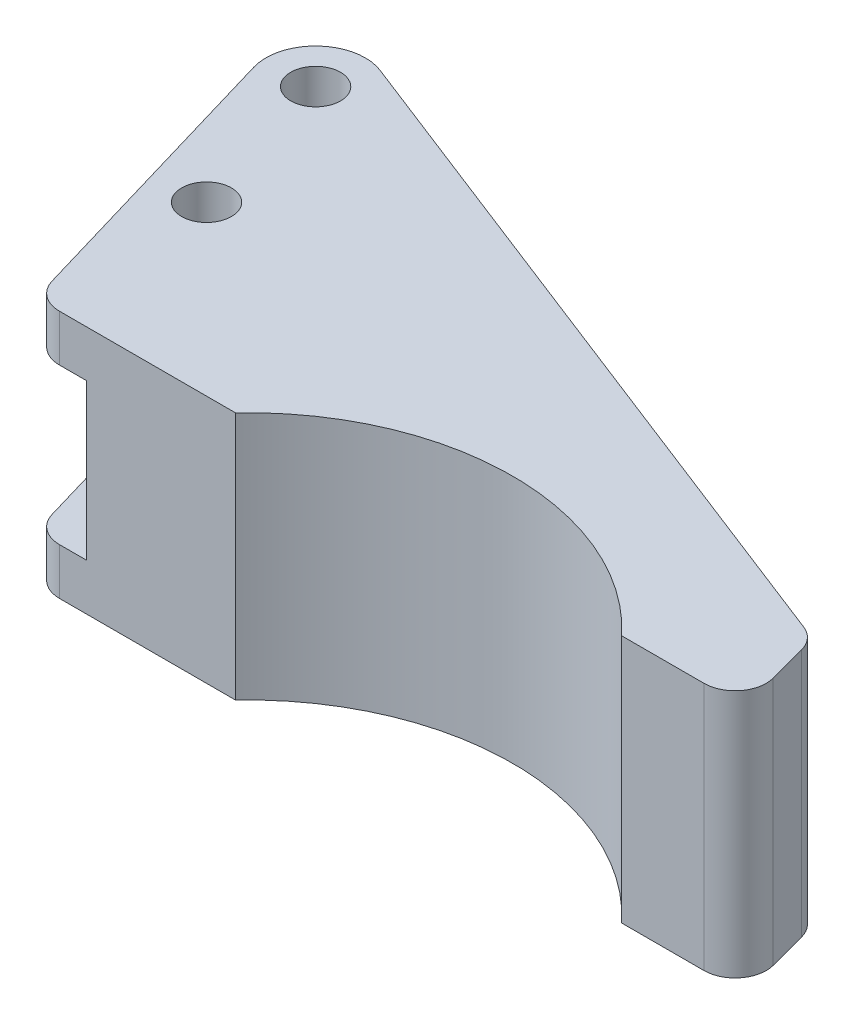
ISO-10303-21;
HEADER;
FILE_DESCRIPTION(('STEP AP214'),'2;1');
FILE_NAME('part.step','',(''),(''),'','','');
FILE_SCHEMA(('AUTOMOTIVE_DESIGN { 1 0 10303 214 1 1 1 1 }'));
ENDSEC;
DATA;
#1=APPLICATION_CONTEXT('core data for automotive mechanical design processes');
#2=APPLICATION_PROTOCOL_DEFINITION('international standard','automotive_design',2000,#1);
#3=PRODUCT_CONTEXT('',#1,'mechanical');
#4=PRODUCT('Part','Part','',(#3));
#5=PRODUCT_RELATED_PRODUCT_CATEGORY('part','',(#4));
#6=PRODUCT_DEFINITION_FORMATION('','',#4);
#7=PRODUCT_DEFINITION_CONTEXT('part definition',#1,'design');
#8=PRODUCT_DEFINITION('design','',#6,#7);
#9=PRODUCT_DEFINITION_SHAPE('','',#8);
#10=(LENGTH_UNIT() NAMED_UNIT(*) SI_UNIT(.MILLI.,.METRE.));
#11=(NAMED_UNIT(*) PLANE_ANGLE_UNIT() SI_UNIT($,.RADIAN.));
#12=(NAMED_UNIT(*) SI_UNIT($,.STERADIAN.) SOLID_ANGLE_UNIT());
#13=UNCERTAINTY_MEASURE_WITH_UNIT(LENGTH_MEASURE(1.E-05),#10,'distance_accuracy_value','');
#14=(GEOMETRIC_REPRESENTATION_CONTEXT(3) GLOBAL_UNCERTAINTY_ASSIGNED_CONTEXT((#13)) GLOBAL_UNIT_ASSIGNED_CONTEXT((#10,
#11,#12)) REPRESENTATION_CONTEXT('',''));
#15=CARTESIAN_POINT('',(0.,0.,0.));
#16=DIRECTION('',(0.,0.,1.));
#17=DIRECTION('',(1.,0.,0.));
#18=AXIS2_PLACEMENT_3D('',#15,#16,#17);
#19=CARTESIAN_POINT('',(-61.4781120918837,40.,-51.87));
#20=DIRECTION('',(0.,-1.,0.));
#21=DIRECTION('',(0.,0.,-1.));
#22=AXIS2_PLACEMENT_3D('',#19,#20,#21);
#23=CYLINDRICAL_SURFACE('',#22,8.);
#24=DIRECTION('',(0.,-1.,0.));
#25=VECTOR('',#24,1.);
#26=CARTESIAN_POINT('',(-69.1516005038733,40.,-49.607794087387));
#27=LINE('',#26,#25);
#28=CARTESIAN_POINT('',(-69.1516005038733,7.5,-49.607794087387));
#29=VERTEX_POINT('',#28);
#30=CARTESIAN_POINT('',(-69.1516005038733,0.,-49.607794087387));
#31=VERTEX_POINT('',#30);
#32=EDGE_CURVE('E148',#29,#31,#27,.T.);
#33=ORIENTED_EDGE('',*,*,#32,.F.);
#34=CARTESIAN_POINT('',(-61.4781120918837,7.5,-51.87));
#35=DIRECTION('',(0.,-1.,0.));
#36=DIRECTION('',(0.,0.,-1.));
#37=AXIS2_PLACEMENT_3D('',#34,#35,#36);
#38=CIRCLE('',#37,8.);
#39=CARTESIAN_POINT('',(-58.5744406098046,7.5,-59.324441087309));
#40=VERTEX_POINT('',#39);
#41=EDGE_CURVE('E231',#29,#40,#38,.T.);
#42=ORIENTED_EDGE('',*,*,#41,.T.);
#43=DIRECTION('',(0.,-1.,0.));
#44=VECTOR('',#43,1.);
#45=CARTESIAN_POINT('',(-58.5744406098046,40.,-59.324441087309));
#46=LINE('',#45,#44);
#47=CARTESIAN_POINT('',(-58.5744406098046,0.,-59.324441087309));
#48=VERTEX_POINT('',#47);
#49=EDGE_CURVE('E190',#40,#48,#46,.T.);
#50=ORIENTED_EDGE('',*,*,#49,.T.);
#51=CARTESIAN_POINT('',(-61.4781120918837,0.,-51.87));
#52=DIRECTION('',(0.,1.,0.));
#53=DIRECTION('',(0.,0.,1.));
#54=AXIS2_PLACEMENT_3D('',#51,#52,#53);
#55=CIRCLE('',#54,8.);
#56=EDGE_CURVE('E174',#48,#31,#55,.T.);
#57=ORIENTED_EDGE('',*,*,#56,.T.);
#58=EDGE_LOOP('',(#33,#42,#50,#57));
#59=FACE_BOUND('',#58,.T.);
#60=ADVANCED_FACE('F33',(#59),#23,.T.);
#61=CARTESIAN_POINT('',(-69.1516005038733,40.,-49.607794087387));
#62=DIRECTION('',(0.959186051498703,0.,-0.282775739076619));
#63=DIRECTION('',(-0.282775739076619,0.,-0.959186051498703));
#64=AXIS2_PLACEMENT_3D('',#61,#62,#63);
#65=PLANE('',#64);
#66=CARTESIAN_POINT('',(-69.1516005038733,40.,-49.607794087387));
#67=VERTEX_POINT('',#66);
#68=CARTESIAN_POINT('',(-69.1516005038733,32.5,-49.607794087387));
#69=VERTEX_POINT('',#68);
#70=EDGE_CURVE('E188',#67,#69,#27,.T.);
#71=ORIENTED_EDGE('',*,*,#70,.T.);
#72=DIRECTION('',(0.282775739076619,0.,0.959186051498703));
#73=VECTOR('',#72,1.);
#74=CARTESIAN_POINT('',(-69.1516005038733,32.5,-49.607794087387));
#75=LINE('',#74,#73);
#76=CARTESIAN_POINT('',(-55.5840423493772,32.5,-3.5861213046169));
#77=VERTEX_POINT('',#76);
#78=EDGE_CURVE('E145',#69,#77,#75,.T.);
#79=ORIENTED_EDGE('',*,*,#78,.T.);
#80=DIRECTION('',(0.,-1.,0.));
#81=VECTOR('',#80,1.);
#82=CARTESIAN_POINT('',(-55.5840423493772,40.,-3.5861213046169));
#83=LINE('',#82,#81);
#84=CARTESIAN_POINT('',(-55.5840423493772,40.,-3.5861213046169));
#85=VERTEX_POINT('',#84);
#86=EDGE_CURVE('E141',#85,#77,#83,.T.);
#87=ORIENTED_EDGE('',*,*,#86,.F.);
#88=DIRECTION('',(0.282775739076619,0.,0.959186051498703));
#89=VECTOR('',#88,1.);
#90=CARTESIAN_POINT('',(-69.1516005038733,40.,-49.607794087387));
#91=LINE('',#90,#89);
#92=EDGE_CURVE('E126',#67,#85,#91,.T.);
#93=ORIENTED_EDGE('',*,*,#92,.F.);
#94=EDGE_LOOP('',(#71,#79,#87,#93));
#95=FACE_BOUND('',#94,.T.);
#96=ADVANCED_FACE('F142',(#95),#65,.F.);
#97=CARTESIAN_POINT('',(-50.7881120918837,40.,-5.));
#98=DIRECTION('',(0.,-1.,0.));
#99=DIRECTION('',(0.,0.,-1.));
#100=AXIS2_PLACEMENT_3D('',#97,#98,#99);
#101=CYLINDRICAL_SURFACE('',#100,5.00000000000001);
#102=ORIENTED_EDGE('',*,*,#86,.T.);
#103=CARTESIAN_POINT('',(-50.7881120918837,32.5,-5.));
#104=DIRECTION('',(0.,1.,0.));
#105=DIRECTION('',(0.,0.,1.));
#106=AXIS2_PLACEMENT_3D('',#103,#104,#105);
#107=CIRCLE('',#106,5.00000000000001);
#108=CARTESIAN_POINT('',(-50.7881120918837,32.5,0.));
#109=VERTEX_POINT('',#108);
#110=EDGE_CURVE('E240',#77,#109,#107,.T.);
#111=ORIENTED_EDGE('',*,*,#110,.T.);
#112=DIRECTION('',(0.,-1.,0.));
#113=VECTOR('',#112,1.);
#114=CARTESIAN_POINT('',(-50.7881120918837,40.,0.));
#115=LINE('',#114,#113);
#116=CARTESIAN_POINT('',(-50.7881120918837,40.,0.));
#117=VERTEX_POINT('',#116);
#118=EDGE_CURVE('E153',#117,#109,#115,.T.);
#119=ORIENTED_EDGE('',*,*,#118,.F.);
#120=CARTESIAN_POINT('',(-50.7881120918837,40.,-5.));
#121=DIRECTION('',(0.,1.,0.));
#122=DIRECTION('',(0.,0.,1.));
#123=AXIS2_PLACEMENT_3D('',#120,#121,#122);
#124=CIRCLE('',#123,5.00000000000001);
#125=EDGE_CURVE('E131',#85,#117,#124,.T.);
#126=ORIENTED_EDGE('',*,*,#125,.F.);
#127=EDGE_LOOP('',(#102,#111,#119,#126));
#128=FACE_BOUND('',#127,.T.);
#129=ADVANCED_FACE('F151',(#128),#101,.T.);
#130=CARTESIAN_POINT('',(-54.1481120918837,40.,-27.));
#131=DIRECTION('',(0.,-1.,0.));
#132=DIRECTION('',(0.,0.,-1.));
#133=AXIS2_PLACEMENT_3D('',#130,#131,#132);
#134=CYLINDRICAL_SURFACE('',#133,4.00000000000001);
#135=CARTESIAN_POINT('',(-54.1481120918837,32.5,-27.));
#136=DIRECTION('',(0.,1.,0.));
#137=DIRECTION('',(0.,0.,1.));
#138=AXIS2_PLACEMENT_3D('',#135,#136,#137);
#139=CIRCLE('',#138,4.00000000000001);
#140=CARTESIAN_POINT('',(-54.1481120918837,32.5,-23.));
#141=VERTEX_POINT('',#140);
#142=EDGE_CURVE('E237',#141,#141,#139,.T.);
#143=ORIENTED_EDGE('',*,*,#142,.F.);
#144=EDGE_LOOP('',(#143));
#145=FACE_BOUND('',#144,.T.);
#146=CARTESIAN_POINT('',(-54.1481120918837,40.,-27.));
#147=DIRECTION('',(0.,1.,0.));
#148=DIRECTION('',(0.,0.,1.));
#149=AXIS2_PLACEMENT_3D('',#146,#147,#148);
#150=CIRCLE('',#149,4.00000000000001);
#151=CARTESIAN_POINT('',(-54.1481120918837,40.,-23.));
#152=VERTEX_POINT('',#151);
#153=EDGE_CURVE('E163',#152,#152,#150,.T.);
#154=ORIENTED_EDGE('',*,*,#153,.T.);
#155=EDGE_LOOP('',(#154));
#156=FACE_BOUND('',#155,.T.);
#157=ADVANCED_FACE('F357',(#145,#156),#134,.F.);
#158=CARTESIAN_POINT('',(-61.4781120918837,40.,-51.87));
#159=DIRECTION('',(0.,-1.,0.));
#160=DIRECTION('',(0.,0.,-1.));
#161=AXIS2_PLACEMENT_3D('',#158,#159,#160);
#162=CYLINDRICAL_SURFACE('',#161,4.00000000000001);
#163=CARTESIAN_POINT('',(-61.4781120918837,32.5,-51.87));
#164=DIRECTION('',(0.,1.,0.));
#165=DIRECTION('',(0.,0.,1.));
#166=AXIS2_PLACEMENT_3D('',#163,#164,#165);
#167=CIRCLE('',#166,4.00000000000001);
#168=CARTESIAN_POINT('',(-61.4781120918837,32.5,-47.87));
#169=VERTEX_POINT('',#168);
#170=EDGE_CURVE('E37',#169,#169,#167,.T.);
#171=ORIENTED_EDGE('',*,*,#170,.F.);
#172=EDGE_LOOP('',(#171));
#173=FACE_BOUND('',#172,.T.);
#174=CARTESIAN_POINT('',(-61.4781120918837,40.,-51.87));
#175=DIRECTION('',(0.,1.,0.));
#176=DIRECTION('',(0.,0.,1.));
#177=AXIS2_PLACEMENT_3D('',#174,#175,#176);
#178=CIRCLE('',#177,4.00000000000001);
#179=CARTESIAN_POINT('',(-61.4781120918837,40.,-47.87));
#180=VERTEX_POINT('',#179);
#181=EDGE_CURVE('E253',#180,#180,#178,.T.);
#182=ORIENTED_EDGE('',*,*,#181,.T.);
#183=EDGE_LOOP('',(#182));
#184=FACE_BOUND('',#183,.T.);
#185=ADVANCED_FACE('F388',(#173,#184),#162,.F.);
#186=CARTESIAN_POINT('',(8.5618879081163,40.,29.01));
#187=DIRECTION('',(0.,-1.,0.));
#188=DIRECTION('',(0.,0.,-1.));
#189=AXIS2_PLACEMENT_3D('',#186,#187,#188);
#190=PLANE('',#189);
#191=CARTESIAN_POINT('',(8.5618879081163,40.,29.01));
#192=DIRECTION('',(0.,-1.,0.));
#193=DIRECTION('',(0.,0.,-1.));
#194=AXIS2_PLACEMENT_3D('',#191,#192,#193);
#195=CIRCLE('',#194,42.49);
#196=CARTESIAN_POINT('',(-22.4835626442593,40.,0.));
#197=VERTEX_POINT('',#196);
#198=CARTESIAN_POINT('',(39.6073384604919,40.,0.));
#199=VERTEX_POINT('',#198);
#200=EDGE_CURVE('E184',#197,#199,#195,.T.);
#201=ORIENTED_EDGE('',*,*,#200,.T.);
#202=DIRECTION('',(1.,0.,0.));
#203=VECTOR('',#202,1.);
#204=CARTESIAN_POINT('',(39.6073384604919,40.,0.));
#205=LINE('',#204,#203);
#206=CARTESIAN_POINT('',(52.8472098376471,40.,0.));
#207=VERTEX_POINT('',#206);
#208=EDGE_CURVE('E105',#199,#207,#205,.T.);
#209=ORIENTED_EDGE('',*,*,#208,.T.);
#210=CARTESIAN_POINT('',(52.8472098376472,40.,-5.));
#211=DIRECTION('',(0.,1.,0.));
#212=DIRECTION('',(0.,0.,1.));
#213=AXIS2_PLACEMENT_3D('',#210,#211,#212);
#214=CIRCLE('',#213,5.);
#215=CARTESIAN_POINT('',(57.6790306704157,40.,-6.28588780226904));
#216=VERTEX_POINT('',#215);
#217=EDGE_CURVE('E265',#207,#216,#214,.T.);
#218=ORIENTED_EDGE('',*,*,#217,.T.);
#219=DIRECTION('',(-0.257177560453808,0.,-0.9663641665537));
#220=VECTOR('',#219,1.);
#221=CARTESIAN_POINT('',(56.0290306704157,40.,-12.485887802269));
#222=LINE('',#221,#220);
#223=CARTESIAN_POINT('',(56.0290306704157,40.,-12.485887802269));
#224=VERTEX_POINT('',#223);
#225=EDGE_CURVE('E267',#216,#224,#222,.T.);
#226=ORIENTED_EDGE('',*,*,#225,.T.);
#227=CARTESIAN_POINT('',(51.1972098376472,40.,-11.2));
#228=DIRECTION('',(0.,1.,0.));
#229=DIRECTION('',(0.,0.,-1.));
#230=AXIS2_PLACEMENT_3D('',#227,#228,#229);
#231=CIRCLE('',#230,5.);
#232=CARTESIAN_POINT('',(53.0120045139466,40.,-15.8590256795681));
#233=VERTEX_POINT('',#232);
#234=EDGE_CURVE('E269',#224,#233,#231,.T.);
#235=ORIENTED_EDGE('',*,*,#234,.T.);
#236=DIRECTION('',(-0.931805135913626,0.,-0.362958935259884));
#237=VECTOR('',#236,1.);
#238=CARTESIAN_POINT('',(53.0120045139466,40.,-15.8590256795681));
#239=LINE('',#238,#237);
#240=CARTESIAN_POINT('',(-58.5744406098046,40.,-59.324441087309));
#241=VERTEX_POINT('',#240);
#242=EDGE_CURVE('E271',#233,#241,#239,.T.);
#243=ORIENTED_EDGE('',*,*,#242,.T.);
#244=CARTESIAN_POINT('',(-61.4781120918837,40.,-51.87));
#245=DIRECTION('',(0.,1.,0.));
#246=DIRECTION('',(0.,0.,1.));
#247=AXIS2_PLACEMENT_3D('',#244,#245,#246);
#248=CIRCLE('',#247,8.);
#249=EDGE_CURVE('E134',#241,#67,#248,.T.);
#250=ORIENTED_EDGE('',*,*,#249,.T.);
#251=ORIENTED_EDGE('',*,*,#92,.T.);
#252=ORIENTED_EDGE('',*,*,#125,.T.);
#253=DIRECTION('',(1.,0.,0.));
#254=VECTOR('',#253,1.);
#255=CARTESIAN_POINT('',(-50.7881120918837,40.,0.));
#256=LINE('',#255,#254);
#257=EDGE_CURVE('E59',#117,#197,#256,.T.);
#258=ORIENTED_EDGE('',*,*,#257,.T.);
#259=EDGE_LOOP('',(#201,#209,#218,#226,#235,#243,#250,#251,#252,#258));
#260=FACE_BOUND('',#259,.T.);
#261=ORIENTED_EDGE('',*,*,#153,.F.);
#262=EDGE_LOOP('',(#261));
#263=FACE_BOUND('',#262,.T.);
#264=ORIENTED_EDGE('',*,*,#181,.F.);
#265=EDGE_LOOP('',(#264));
#266=FACE_BOUND('',#265,.T.);
#267=ADVANCED_FACE('F128',(#260,#263,#266),#190,.F.);
#268=CARTESIAN_POINT('',(8.5618879081163,0.,29.01));
#269=DIRECTION('',(0.,-1.,0.));
#270=DIRECTION('',(0.,0.,-1.));
#271=AXIS2_PLACEMENT_3D('',#268,#269,#270);
#272=PLANE('',#271);
#273=CARTESIAN_POINT('',(-54.1481120918837,0.,-27.));
#274=DIRECTION('',(0.,1.,0.));
#275=DIRECTION('',(0.,0.,1.));
#276=AXIS2_PLACEMENT_3D('',#273,#274,#275);
#277=CIRCLE('',#276,4.00000000000001);
#278=CARTESIAN_POINT('',(-54.1481120918837,0.,-23.));
#279=VERTEX_POINT('',#278);
#280=EDGE_CURVE('E256',#279,#279,#277,.T.);
#281=ORIENTED_EDGE('',*,*,#280,.T.);
#282=EDGE_LOOP('',(#281));
#283=FACE_BOUND('',#282,.T.);
#284=CARTESIAN_POINT('',(8.5618879081163,0.,29.01));
#285=DIRECTION('',(0.,-1.,0.));
#286=DIRECTION('',(0.,0.,-1.));
#287=AXIS2_PLACEMENT_3D('',#284,#285,#286);
#288=CIRCLE('',#287,42.49);
#289=CARTESIAN_POINT('',(-22.4835626442593,0.,0.));
#290=VERTEX_POINT('',#289);
#291=CARTESIAN_POINT('',(39.6073384604919,0.,0.));
#292=VERTEX_POINT('',#291);
#293=EDGE_CURVE('E159',#290,#292,#288,.T.);
#294=ORIENTED_EDGE('',*,*,#293,.F.);
#295=DIRECTION('',(1.,0.,0.));
#296=VECTOR('',#295,1.);
#297=CARTESIAN_POINT('',(-50.7881120918837,0.,0.));
#298=LINE('',#297,#296);
#299=CARTESIAN_POINT('',(-50.7881120918837,0.,0.));
#300=VERTEX_POINT('',#299);
#301=EDGE_CURVE('E97',#300,#290,#298,.T.);
#302=ORIENTED_EDGE('',*,*,#301,.F.);
#303=CARTESIAN_POINT('',(-50.7881120918837,0.,-5.));
#304=DIRECTION('',(0.,1.,0.));
#305=DIRECTION('',(0.,0.,1.));
#306=AXIS2_PLACEMENT_3D('',#303,#304,#305);
#307=CIRCLE('',#306,5.00000000000001);
#308=CARTESIAN_POINT('',(-55.5840423493772,0.,-3.5861213046169));
#309=VERTEX_POINT('',#308);
#310=EDGE_CURVE('E180',#309,#300,#307,.T.);
#311=ORIENTED_EDGE('',*,*,#310,.F.);
#312=DIRECTION('',(0.282775739076619,0.,0.959186051498703));
#313=VECTOR('',#312,1.);
#314=CARTESIAN_POINT('',(-69.1516005038733,0.,-49.607794087387));
#315=LINE('',#314,#313);
#316=EDGE_CURVE('E177',#31,#309,#315,.T.);
#317=ORIENTED_EDGE('',*,*,#316,.F.);
#318=ORIENTED_EDGE('',*,*,#56,.F.);
#319=DIRECTION('',(-0.931805135913626,0.,-0.362958935259884));
#320=VECTOR('',#319,1.);
#321=CARTESIAN_POINT('',(53.0120045139466,0.,-15.8590256795681));
#322=LINE('',#321,#320);
#323=CARTESIAN_POINT('',(53.0120045139466,0.,-15.8590256795681));
#324=VERTEX_POINT('',#323);
#325=EDGE_CURVE('E171',#324,#48,#322,.T.);
#326=ORIENTED_EDGE('',*,*,#325,.F.);
#327=CARTESIAN_POINT('',(51.1972098376472,0.,-11.2));
#328=DIRECTION('',(0.,1.,0.));
#329=DIRECTION('',(0.,0.,-1.));
#330=AXIS2_PLACEMENT_3D('',#327,#328,#329);
#331=CIRCLE('',#330,5.);
#332=CARTESIAN_POINT('',(56.0290306704157,0.,-12.485887802269));
#333=VERTEX_POINT('',#332);
#334=EDGE_CURVE('E169',#333,#324,#331,.T.);
#335=ORIENTED_EDGE('',*,*,#334,.F.);
#336=DIRECTION('',(-0.257177560453808,0.,-0.9663641665537));
#337=VECTOR('',#336,1.);
#338=CARTESIAN_POINT('',(56.0290306704157,0.,-12.485887802269));
#339=LINE('',#338,#337);
#340=CARTESIAN_POINT('',(57.6790306704157,0.,-6.28588780226904));
#341=VERTEX_POINT('',#340);
#342=EDGE_CURVE('E167',#341,#333,#339,.T.);
#343=ORIENTED_EDGE('',*,*,#342,.F.);
#344=CARTESIAN_POINT('',(52.8472098376472,0.,-5.));
#345=DIRECTION('',(0.,1.,0.));
#346=DIRECTION('',(0.,0.,1.));
#347=AXIS2_PLACEMENT_3D('',#344,#345,#346);
#348=CIRCLE('',#347,5.);
#349=CARTESIAN_POINT('',(52.8472098376471,0.,0.));
#350=VERTEX_POINT('',#349);
#351=EDGE_CURVE('E165',#350,#341,#348,.T.);
#352=ORIENTED_EDGE('',*,*,#351,.F.);
#353=DIRECTION('',(1.,0.,0.));
#354=VECTOR('',#353,1.);
#355=CARTESIAN_POINT('',(39.6073384604919,0.,0.));
#356=LINE('',#355,#354);
#357=EDGE_CURVE('E162',#292,#350,#356,.T.);
#358=ORIENTED_EDGE('',*,*,#357,.F.);
#359=EDGE_LOOP('',(#294,#302,#311,#317,#318,#326,#335,#343,#352,#358));
#360=FACE_BOUND('',#359,.T.);
#361=CARTESIAN_POINT('',(-61.4781120918837,0.,-51.87));
#362=DIRECTION('',(0.,1.,0.));
#363=DIRECTION('',(0.,0.,1.));
#364=AXIS2_PLACEMENT_3D('',#361,#362,#363);
#365=CIRCLE('',#364,4.00000000000001);
#366=CARTESIAN_POINT('',(-61.4781120918837,0.,-47.87));
#367=VERTEX_POINT('',#366);
#368=EDGE_CURVE('E252',#367,#367,#365,.T.);
#369=ORIENTED_EDGE('',*,*,#368,.T.);
#370=EDGE_LOOP('',(#369));
#371=FACE_BOUND('',#370,.T.);
#372=ADVANCED_FACE('F336',(#283,#360,#371),#272,.T.);
#373=CARTESIAN_POINT('',(8.5618879081163,40.,29.01));
#374=DIRECTION('',(0.,-1.,0.));
#375=DIRECTION('',(0.,0.,-1.));
#376=AXIS2_PLACEMENT_3D('',#373,#374,#375);
#377=CYLINDRICAL_SURFACE('',#376,42.49);
#378=ORIENTED_EDGE('',*,*,#293,.T.);
#379=DIRECTION('',(0.,-1.,0.));
#380=VECTOR('',#379,1.);
#381=CARTESIAN_POINT('',(39.6073384604919,40.,0.));
#382=LINE('',#381,#380);
#383=EDGE_CURVE('E11',#199,#292,#382,.T.);
#384=ORIENTED_EDGE('',*,*,#383,.F.);
#385=ORIENTED_EDGE('',*,*,#200,.F.);
#386=DIRECTION('',(0.,-1.,0.));
#387=VECTOR('',#386,1.);
#388=CARTESIAN_POINT('',(-22.4835626442593,40.,0.));
#389=LINE('',#388,#387);
#390=EDGE_CURVE('E155',#197,#290,#389,.T.);
#391=ORIENTED_EDGE('',*,*,#390,.T.);
#392=EDGE_LOOP('',(#378,#384,#385,#391));
#393=FACE_BOUND('',#392,.T.);
#394=ADVANCED_FACE('F35',(#393),#377,.F.);
#395=CARTESIAN_POINT('',(39.6073384604919,40.,0.));
#396=DIRECTION('',(0.,0.,-1.));
#397=DIRECTION('',(-1.,0.,0.));
#398=AXIS2_PLACEMENT_3D('',#395,#396,#397);
#399=PLANE('',#398);
#400=ORIENTED_EDGE('',*,*,#357,.T.);
#401=DIRECTION('',(0.,-1.,0.));
#402=VECTOR('',#401,1.);
#403=CARTESIAN_POINT('',(52.8472098376471,40.,0.));
#404=LINE('',#403,#402);
#405=EDGE_CURVE('E42',#207,#350,#404,.T.);
#406=ORIENTED_EDGE('',*,*,#405,.F.);
#407=ORIENTED_EDGE('',*,*,#208,.F.);
#408=ORIENTED_EDGE('',*,*,#383,.T.);
#409=EDGE_LOOP('',(#400,#406,#407,#408));
#410=FACE_BOUND('',#409,.T.);
#411=ADVANCED_FACE('F320',(#410),#399,.F.);
#412=CARTESIAN_POINT('',(52.8472098376472,40.,-5.));
#413=DIRECTION('',(0.,-1.,0.));
#414=DIRECTION('',(0.,0.,-1.));
#415=AXIS2_PLACEMENT_3D('',#412,#413,#414);
#416=CYLINDRICAL_SURFACE('',#415,5.);
#417=ORIENTED_EDGE('',*,*,#351,.T.);
#418=DIRECTION('',(0.,-1.,0.));
#419=VECTOR('',#418,1.);
#420=CARTESIAN_POINT('',(57.6790306704157,40.,-6.28588780226904));
#421=LINE('',#420,#419);
#422=EDGE_CURVE('E200',#216,#341,#421,.T.);
#423=ORIENTED_EDGE('',*,*,#422,.F.);
#424=ORIENTED_EDGE('',*,*,#217,.F.);
#425=ORIENTED_EDGE('',*,*,#405,.T.);
#426=EDGE_LOOP('',(#417,#423,#424,#425));
#427=FACE_BOUND('',#426,.T.);
#428=ADVANCED_FACE('F323',(#427),#416,.T.);
#429=CARTESIAN_POINT('',(56.0290306704157,40.,-12.485887802269));
#430=DIRECTION('',(-0.9663641665537,0.,0.257177560453808));
#431=DIRECTION('',(0.257177560453808,0.,0.9663641665537));
#432=AXIS2_PLACEMENT_3D('',#429,#430,#431);
#433=PLANE('',#432);
#434=ORIENTED_EDGE('',*,*,#342,.T.);
#435=DIRECTION('',(0.,-1.,0.));
#436=VECTOR('',#435,1.);
#437=CARTESIAN_POINT('',(56.0290306704157,40.,-12.485887802269));
#438=LINE('',#437,#436);
#439=EDGE_CURVE('E197',#224,#333,#438,.T.);
#440=ORIENTED_EDGE('',*,*,#439,.F.);
#441=ORIENTED_EDGE('',*,*,#225,.F.);
#442=ORIENTED_EDGE('',*,*,#422,.T.);
#443=EDGE_LOOP('',(#434,#440,#441,#442));
#444=FACE_BOUND('',#443,.T.);
#445=ADVANCED_FACE('F328',(#444),#433,.F.);
#446=CARTESIAN_POINT('',(51.1972098376472,40.,-11.2));
#447=DIRECTION('',(0.,-1.,0.));
#448=DIRECTION('',(0.,0.,-1.));
#449=AXIS2_PLACEMENT_3D('',#446,#447,#448);
#450=CYLINDRICAL_SURFACE('',#449,5.);
#451=ORIENTED_EDGE('',*,*,#334,.T.);
#452=DIRECTION('',(0.,-1.,0.));
#453=VECTOR('',#452,1.);
#454=CARTESIAN_POINT('',(53.0120045139466,40.,-15.8590256795681));
#455=LINE('',#454,#453);
#456=EDGE_CURVE('E194',#233,#324,#455,.T.);
#457=ORIENTED_EDGE('',*,*,#456,.F.);
#458=ORIENTED_EDGE('',*,*,#234,.F.);
#459=ORIENTED_EDGE('',*,*,#439,.T.);
#460=EDGE_LOOP('',(#451,#457,#458,#459));
#461=FACE_BOUND('',#460,.T.);
#462=ADVANCED_FACE('F331',(#461),#450,.T.);
#463=CARTESIAN_POINT('',(53.0120045139466,40.,-15.8590256795681));
#464=DIRECTION('',(-0.362958935259884,0.,0.931805135913626));
#465=DIRECTION('',(0.931805135913626,0.,0.362958935259884));
#466=AXIS2_PLACEMENT_3D('',#463,#464,#465);
#467=PLANE('',#466);
#468=DIRECTION('',(0.,1.,0.));
#469=VECTOR('',#468,1.);
#470=CARTESIAN_POINT('',(-46.4781120918837,40.,-54.6126506601039));
#471=LINE('',#470,#469);
#472=CARTESIAN_POINT('',(-46.4781120918837,7.5,-54.6126506601039));
#473=VERTEX_POINT('',#472);
#474=CARTESIAN_POINT('',(-46.4781120918837,32.5,-54.6126506601039));
#475=VERTEX_POINT('',#474);
#476=EDGE_CURVE('E249',#473,#475,#471,.T.);
#477=ORIENTED_EDGE('',*,*,#476,.T.);
#478=DIRECTION('',(-0.931805135913626,0.,-0.362958935259884));
#479=VECTOR('',#478,1.);
#480=CARTESIAN_POINT('',(53.0120045139466,32.5,-15.8590256795681));
#481=LINE('',#480,#479);
#482=CARTESIAN_POINT('',(-58.5744406098046,32.5,-59.324441087309));
#483=VERTEX_POINT('',#482);
#484=EDGE_CURVE('E246',#475,#483,#481,.T.);
#485=ORIENTED_EDGE('',*,*,#484,.T.);
#486=EDGE_CURVE('E191',#241,#483,#46,.T.);
#487=ORIENTED_EDGE('',*,*,#486,.F.);
#488=ORIENTED_EDGE('',*,*,#242,.F.);
#489=ORIENTED_EDGE('',*,*,#456,.T.);
#490=ORIENTED_EDGE('',*,*,#325,.T.);
#491=ORIENTED_EDGE('',*,*,#49,.F.);
#492=DIRECTION('',(0.931805135913626,0.,0.362958935259884));
#493=VECTOR('',#492,1.);
#494=CARTESIAN_POINT('',(53.0120045139466,7.5,-15.8590256795681));
#495=LINE('',#494,#493);
#496=EDGE_CURVE('E234',#40,#473,#495,.T.);
#497=ORIENTED_EDGE('',*,*,#496,.T.);
#498=EDGE_LOOP('',(#477,#485,#487,#488,#489,#490,#491,#497));
#499=FACE_BOUND('',#498,.T.);
#500=ADVANCED_FACE('F277',(#499),#467,.F.);
#501=CARTESIAN_POINT('',(-61.4781120918837,32.5,-51.87));
#502=DIRECTION('',(0.,1.,0.));
#503=DIRECTION('',(0.,0.,1.));
#504=AXIS2_PLACEMENT_3D('',#501,#502,#503);
#505=CIRCLE('',#504,8.);
#506=EDGE_CURVE('E243',#483,#69,#505,.T.);
#507=ORIENTED_EDGE('',*,*,#506,.T.);
#508=ORIENTED_EDGE('',*,*,#70,.F.);
#509=ORIENTED_EDGE('',*,*,#249,.F.);
#510=ORIENTED_EDGE('',*,*,#486,.T.);
#511=EDGE_LOOP('',(#507,#508,#509,#510));
#512=FACE_BOUND('',#511,.T.);
#513=ADVANCED_FACE('F279',(#512),#23,.T.);
#514=CARTESIAN_POINT('',(-55.5840423493772,7.5,-3.5861213046169));
#515=VERTEX_POINT('',#514);
#516=EDGE_CURVE('E149',#515,#309,#83,.T.);
#517=ORIENTED_EDGE('',*,*,#516,.F.);
#518=DIRECTION('',(-0.282775739076619,0.,-0.959186051498703));
#519=VECTOR('',#518,1.);
#520=CARTESIAN_POINT('',(-69.1516005038733,7.5,-49.607794087387));
#521=LINE('',#520,#519);
#522=EDGE_CURVE('E228',#515,#29,#521,.T.);
#523=ORIENTED_EDGE('',*,*,#522,.T.);
#524=ORIENTED_EDGE('',*,*,#32,.T.);
#525=ORIENTED_EDGE('',*,*,#316,.T.);
#526=EDGE_LOOP('',(#517,#523,#524,#525));
#527=FACE_BOUND('',#526,.T.);
#528=ADVANCED_FACE('F344',(#527),#65,.F.);
#529=CARTESIAN_POINT('',(-50.7881120918837,7.5,0.));
#530=VERTEX_POINT('',#529);
#531=EDGE_CURVE('E186',#530,#300,#115,.T.);
#532=ORIENTED_EDGE('',*,*,#531,.F.);
#533=CARTESIAN_POINT('',(-50.7881120918837,7.5,-5.));
#534=DIRECTION('',(0.,-1.,0.));
#535=DIRECTION('',(0.,0.,-1.));
#536=AXIS2_PLACEMENT_3D('',#533,#534,#535);
#537=CIRCLE('',#536,5.00000000000001);
#538=EDGE_CURVE('E50',#530,#515,#537,.T.);
#539=ORIENTED_EDGE('',*,*,#538,.T.);
#540=ORIENTED_EDGE('',*,*,#516,.T.);
#541=ORIENTED_EDGE('',*,*,#310,.T.);
#542=EDGE_LOOP('',(#532,#539,#540,#541));
#543=FACE_BOUND('',#542,.T.);
#544=ADVANCED_FACE('F346',(#543),#101,.T.);
#545=CARTESIAN_POINT('',(-50.7881120918837,40.,0.));
#546=DIRECTION('',(0.,0.,-1.));
#547=DIRECTION('',(-1.,0.,0.));
#548=AXIS2_PLACEMENT_3D('',#545,#546,#547);
#549=PLANE('',#548);
#550=ORIENTED_EDGE('',*,*,#118,.T.);
#551=DIRECTION('',(-1.,0.,0.));
#552=VECTOR('',#551,1.);
#553=CARTESIAN_POINT('',(-69.4781120918837,32.5,0.));
#554=LINE('',#553,#552);
#555=CARTESIAN_POINT('',(-46.4781120918837,32.5,0.));
#556=VERTEX_POINT('',#555);
#557=EDGE_CURVE('E222',#556,#109,#554,.T.);
#558=ORIENTED_EDGE('',*,*,#557,.F.);
#559=DIRECTION('',(0.,1.,0.));
#560=VECTOR('',#559,1.);
#561=CARTESIAN_POINT('',(-46.4781120918837,32.5,0.));
#562=LINE('',#561,#560);
#563=CARTESIAN_POINT('',(-46.4781120918837,7.5,0.));
#564=VERTEX_POINT('',#563);
#565=EDGE_CURVE('E306',#564,#556,#562,.T.);
#566=ORIENTED_EDGE('',*,*,#565,.F.);
#567=DIRECTION('',(1.,0.,0.));
#568=VECTOR('',#567,1.);
#569=CARTESIAN_POINT('',(-69.4781120918837,7.5,0.));
#570=LINE('',#569,#568);
#571=EDGE_CURVE('E308',#530,#564,#570,.T.);
#572=ORIENTED_EDGE('',*,*,#571,.F.);
#573=ORIENTED_EDGE('',*,*,#531,.T.);
#574=ORIENTED_EDGE('',*,*,#301,.T.);
#575=ORIENTED_EDGE('',*,*,#390,.F.);
#576=ORIENTED_EDGE('',*,*,#257,.F.);
#577=EDGE_LOOP('',(#550,#558,#566,#572,#573,#574,#575,#576));
#578=FACE_BOUND('',#577,.T.);
#579=ADVANCED_FACE('F312',(#578),#549,.F.);
#580=CARTESIAN_POINT('',(-54.1481120918837,7.5,-27.));
#581=DIRECTION('',(0.,-1.,0.));
#582=DIRECTION('',(0.,0.,-1.));
#583=AXIS2_PLACEMENT_3D('',#580,#581,#582);
#584=CIRCLE('',#583,4.00000000000001);
#585=CARTESIAN_POINT('',(-54.1481120918837,7.5,-31.));
#586=VERTEX_POINT('',#585);
#587=EDGE_CURVE('E206',#586,#586,#584,.T.);
#588=ORIENTED_EDGE('',*,*,#587,.F.);
#589=EDGE_LOOP('',(#588));
#590=FACE_BOUND('',#589,.T.);
#591=ORIENTED_EDGE('',*,*,#280,.F.);
#592=EDGE_LOOP('',(#591));
#593=FACE_BOUND('',#592,.T.);
#594=ADVANCED_FACE('F353',(#590,#593),#134,.F.);
#595=CARTESIAN_POINT('',(-61.4781120918837,7.5,-51.87));
#596=DIRECTION('',(0.,-1.,0.));
#597=DIRECTION('',(0.,0.,-1.));
#598=AXIS2_PLACEMENT_3D('',#595,#596,#597);
#599=CIRCLE('',#598,4.00000000000001);
#600=CARTESIAN_POINT('',(-61.4781120918837,7.5,-55.87));
#601=VERTEX_POINT('',#600);
#602=EDGE_CURVE('E204',#601,#601,#599,.T.);
#603=ORIENTED_EDGE('',*,*,#602,.F.);
#604=EDGE_LOOP('',(#603));
#605=FACE_BOUND('',#604,.T.);
#606=ORIENTED_EDGE('',*,*,#368,.F.);
#607=EDGE_LOOP('',(#606));
#608=FACE_BOUND('',#607,.T.);
#609=ADVANCED_FACE('F393',(#605,#608),#162,.F.);
#610=CARTESIAN_POINT('',(-46.4781120918837,32.5,-59.87));
#611=DIRECTION('',(1.,0.,0.));
#612=DIRECTION('',(0.,1.,0.));
#613=AXIS2_PLACEMENT_3D('',#610,#611,#612);
#614=PLANE('',#613);
#615=DIRECTION('',(0.,0.,1.));
#616=VECTOR('',#615,1.);
#617=CARTESIAN_POINT('',(-46.4781120918837,7.5,-59.87));
#618=LINE('',#617,#616);
#619=EDGE_CURVE('E213',#473,#564,#618,.T.);
#620=ORIENTED_EDGE('',*,*,#619,.T.);
#621=ORIENTED_EDGE('',*,*,#565,.T.);
#622=DIRECTION('',(0.,0.,1.));
#623=VECTOR('',#622,1.);
#624=CARTESIAN_POINT('',(-46.4781120918837,32.5,-59.87));
#625=LINE('',#624,#623);
#626=EDGE_CURVE('E207',#475,#556,#625,.T.);
#627=ORIENTED_EDGE('',*,*,#626,.F.);
#628=ORIENTED_EDGE('',*,*,#476,.F.);
#629=EDGE_LOOP('',(#620,#621,#627,#628));
#630=FACE_BOUND('',#629,.T.);
#631=ADVANCED_FACE('F304',(#630),#614,.F.);
#632=CARTESIAN_POINT('',(-69.4781120918837,32.5,-59.87));
#633=DIRECTION('',(0.,1.,0.));
#634=DIRECTION('',(0.,0.,1.));
#635=AXIS2_PLACEMENT_3D('',#632,#633,#634);
#636=PLANE('',#635);
#637=ORIENTED_EDGE('',*,*,#142,.T.);
#638=EDGE_LOOP('',(#637));
#639=FACE_BOUND('',#638,.T.);
#640=ORIENTED_EDGE('',*,*,#170,.T.);
#641=EDGE_LOOP('',(#640));
#642=FACE_BOUND('',#641,.T.);
#643=ORIENTED_EDGE('',*,*,#626,.T.);
#644=ORIENTED_EDGE('',*,*,#557,.T.);
#645=ORIENTED_EDGE('',*,*,#110,.F.);
#646=ORIENTED_EDGE('',*,*,#78,.F.);
#647=ORIENTED_EDGE('',*,*,#506,.F.);
#648=ORIENTED_EDGE('',*,*,#484,.F.);
#649=EDGE_LOOP('',(#643,#644,#645,#646,#647,#648));
#650=FACE_BOUND('',#649,.T.);
#651=ADVANCED_FACE('F313',(#639,#642,#650),#636,.F.);
#652=CARTESIAN_POINT('',(-69.4781120918837,7.5,-59.87));
#653=DIRECTION('',(0.,-1.,0.));
#654=DIRECTION('',(0.,0.,-1.));
#655=AXIS2_PLACEMENT_3D('',#652,#653,#654);
#656=PLANE('',#655);
#657=ORIENTED_EDGE('',*,*,#587,.T.);
#658=EDGE_LOOP('',(#657));
#659=FACE_BOUND('',#658,.T.);
#660=ORIENTED_EDGE('',*,*,#602,.T.);
#661=EDGE_LOOP('',(#660));
#662=FACE_BOUND('',#661,.T.);
#663=ORIENTED_EDGE('',*,*,#41,.F.);
#664=ORIENTED_EDGE('',*,*,#522,.F.);
#665=ORIENTED_EDGE('',*,*,#538,.F.);
#666=ORIENTED_EDGE('',*,*,#571,.T.);
#667=ORIENTED_EDGE('',*,*,#619,.F.);
#668=ORIENTED_EDGE('',*,*,#496,.F.);
#669=EDGE_LOOP('',(#663,#664,#665,#666,#667,#668));
#670=FACE_BOUND('',#669,.T.);
#671=ADVANCED_FACE('F309',(#659,#662,#670),#656,.F.);
#672=CLOSED_SHELL('',(#60,#96,#129,#157,#185,#267,#372,#394,#411,#428,#445,#462,#500,#513,#528,
#544,#579,#594,#609,#631,#651,#671));
#673=MANIFOLD_SOLID_BREP('B2',#672);
#674=ADVANCED_BREP_SHAPE_REPRESENTATION('',(#18,#673),#14);
#675=SHAPE_DEFINITION_REPRESENTATION(#9,#674);
ENDSEC;
END-ISO-10303-21;
